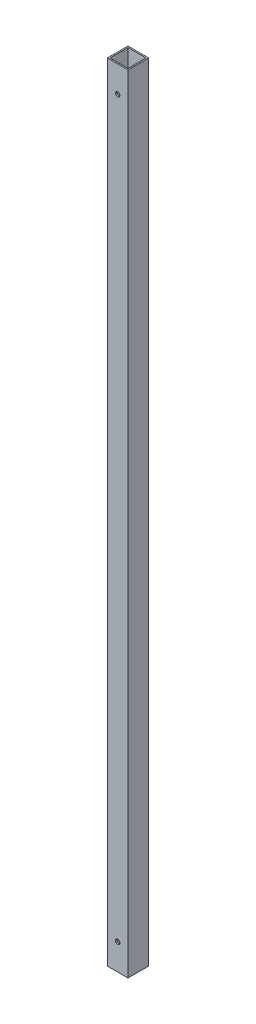
ISO-10303-21;
HEADER;
FILE_DESCRIPTION(('STEP AP214'),'2;1');
FILE_NAME('part.step','',(''),(''),'','','');
FILE_SCHEMA(('AUTOMOTIVE_DESIGN { 1 0 10303 214 1 1 1 1 }'));
ENDSEC;
DATA;
#1=APPLICATION_CONTEXT('core data for automotive mechanical design processes');
#2=APPLICATION_PROTOCOL_DEFINITION('international standard','automotive_design',2000,#1);
#3=PRODUCT_CONTEXT('',#1,'mechanical');
#4=PRODUCT('Part','Part','',(#3));
#5=PRODUCT_RELATED_PRODUCT_CATEGORY('part','',(#4));
#6=PRODUCT_DEFINITION_FORMATION('','',#4);
#7=PRODUCT_DEFINITION_CONTEXT('part definition',#1,'design');
#8=PRODUCT_DEFINITION('design','',#6,#7);
#9=PRODUCT_DEFINITION_SHAPE('','',#8);
#10=(LENGTH_UNIT() NAMED_UNIT(*) SI_UNIT(.MILLI.,.METRE.));
#11=(NAMED_UNIT(*) PLANE_ANGLE_UNIT() SI_UNIT($,.RADIAN.));
#12=(NAMED_UNIT(*) SI_UNIT($,.STERADIAN.) SOLID_ANGLE_UNIT());
#13=UNCERTAINTY_MEASURE_WITH_UNIT(LENGTH_MEASURE(1.E-05),#10,'distance_accuracy_value','');
#14=(GEOMETRIC_REPRESENTATION_CONTEXT(3) GLOBAL_UNCERTAINTY_ASSIGNED_CONTEXT((#13)) GLOBAL_UNIT_ASSIGNED_CONTEXT((#10,
#11,#12)) REPRESENTATION_CONTEXT('',''));
#15=CARTESIAN_POINT('',(0.,0.,0.));
#16=DIRECTION('',(0.,0.,1.));
#17=DIRECTION('',(1.,0.,0.));
#18=AXIS2_PLACEMENT_3D('',#15,#16,#17);
#19=CARTESIAN_POINT('',(0.,600.,0.));
#20=DIRECTION('',(0.,-1.,0.));
#21=DIRECTION('',(0.,0.,-1.));
#22=AXIS2_PLACEMENT_3D('',#19,#20,#21);
#23=PLANE('',#22);
#24=DIRECTION('',(0.,0.,-1.));
#25=VECTOR('',#24,1.);
#26=CARTESIAN_POINT('',(7.9,600.,7.9));
#27=LINE('',#26,#25);
#28=CARTESIAN_POINT('',(7.9,600.,7.9));
#29=VERTEX_POINT('',#28);
#30=CARTESIAN_POINT('',(7.9,600.,-7.9));
#31=VERTEX_POINT('',#30);
#32=EDGE_CURVE('E142',#29,#31,#27,.T.);
#33=ORIENTED_EDGE('',*,*,#32,.T.);
#34=DIRECTION('',(-1.,0.,0.));
#35=VECTOR('',#34,1.);
#36=CARTESIAN_POINT('',(-7.9,600.,-7.9));
#37=LINE('',#36,#35);
#38=CARTESIAN_POINT('',(-7.9,600.,-7.9));
#39=VERTEX_POINT('',#38);
#40=EDGE_CURVE('E145',#31,#39,#37,.T.);
#41=ORIENTED_EDGE('',*,*,#40,.T.);
#42=DIRECTION('',(0.,0.,1.));
#43=VECTOR('',#42,1.);
#44=CARTESIAN_POINT('',(-7.9,600.,7.9));
#45=LINE('',#44,#43);
#46=CARTESIAN_POINT('',(-7.9,600.,7.9));
#47=VERTEX_POINT('',#46);
#48=EDGE_CURVE('E148',#39,#47,#45,.T.);
#49=ORIENTED_EDGE('',*,*,#48,.T.);
#50=DIRECTION('',(1.,0.,0.));
#51=VECTOR('',#50,1.);
#52=CARTESIAN_POINT('',(-7.9,600.,7.9));
#53=LINE('',#52,#51);
#54=EDGE_CURVE('E150',#47,#29,#53,.T.);
#55=ORIENTED_EDGE('',*,*,#54,.T.);
#56=EDGE_LOOP('',(#33,#41,#49,#55));
#57=FACE_BOUND('',#56,.T.);
#58=DIRECTION('',(1.,0.,0.));
#59=VECTOR('',#58,1.);
#60=CARTESIAN_POINT('',(-6.9,600.,6.9));
#61=LINE('',#60,#59);
#62=CARTESIAN_POINT('',(-6.9,600.,6.9));
#63=VERTEX_POINT('',#62);
#64=CARTESIAN_POINT('',(6.9,600.,6.9));
#65=VERTEX_POINT('',#64);
#66=EDGE_CURVE('E104',#63,#65,#61,.T.);
#67=ORIENTED_EDGE('',*,*,#66,.F.);
#68=DIRECTION('',(0.,0.,1.));
#69=VECTOR('',#68,1.);
#70=CARTESIAN_POINT('',(-6.9,600.,6.9));
#71=LINE('',#70,#69);
#72=CARTESIAN_POINT('',(-6.9,600.,-6.9));
#73=VERTEX_POINT('',#72);
#74=EDGE_CURVE('E126',#73,#63,#71,.T.);
#75=ORIENTED_EDGE('',*,*,#74,.F.);
#76=DIRECTION('',(-1.,0.,0.));
#77=VECTOR('',#76,1.);
#78=CARTESIAN_POINT('',(-6.9,600.,-6.9));
#79=LINE('',#78,#77);
#80=CARTESIAN_POINT('',(6.9,600.,-6.9));
#81=VERTEX_POINT('',#80);
#82=EDGE_CURVE('E124',#81,#73,#79,.T.);
#83=ORIENTED_EDGE('',*,*,#82,.F.);
#84=DIRECTION('',(0.,0.,-1.));
#85=VECTOR('',#84,1.);
#86=CARTESIAN_POINT('',(6.9,600.,6.9));
#87=LINE('',#86,#85);
#88=EDGE_CURVE('E112',#65,#81,#87,.T.);
#89=ORIENTED_EDGE('',*,*,#88,.F.);
#90=EDGE_LOOP('',(#67,#75,#83,#89));
#91=FACE_BOUND('',#90,.T.);
#92=ADVANCED_FACE('F37',(#57,#91),#23,.F.);
#93=CARTESIAN_POINT('',(0.,0.,0.));
#94=DIRECTION('',(0.,-1.,0.));
#95=DIRECTION('',(0.,0.,-1.));
#96=AXIS2_PLACEMENT_3D('',#93,#94,#95);
#97=PLANE('',#96);
#98=DIRECTION('',(0.,0.,-1.));
#99=VECTOR('',#98,1.);
#100=CARTESIAN_POINT('',(7.9,0.,7.9));
#101=LINE('',#100,#99);
#102=CARTESIAN_POINT('',(7.9,0.,7.9));
#103=VERTEX_POINT('',#102);
#104=CARTESIAN_POINT('',(7.9,0.,-7.9));
#105=VERTEX_POINT('',#104);
#106=EDGE_CURVE('E120',#103,#105,#101,.T.);
#107=ORIENTED_EDGE('',*,*,#106,.F.);
#108=DIRECTION('',(1.,0.,0.));
#109=VECTOR('',#108,1.);
#110=CARTESIAN_POINT('',(-7.9,0.,7.9));
#111=LINE('',#110,#109);
#112=CARTESIAN_POINT('',(-7.9,0.,7.9));
#113=VERTEX_POINT('',#112);
#114=EDGE_CURVE('E146',#113,#103,#111,.T.);
#115=ORIENTED_EDGE('',*,*,#114,.F.);
#116=DIRECTION('',(0.,0.,1.));
#117=VECTOR('',#116,1.);
#118=CARTESIAN_POINT('',(-7.9,0.,7.9));
#119=LINE('',#118,#117);
#120=CARTESIAN_POINT('',(-7.9,0.,-7.9));
#121=VERTEX_POINT('',#120);
#122=EDGE_CURVE('E157',#121,#113,#119,.T.);
#123=ORIENTED_EDGE('',*,*,#122,.F.);
#124=DIRECTION('',(-1.,0.,0.));
#125=VECTOR('',#124,1.);
#126=CARTESIAN_POINT('',(-7.9,0.,-7.9));
#127=LINE('',#126,#125);
#128=EDGE_CURVE('E155',#105,#121,#127,.T.);
#129=ORIENTED_EDGE('',*,*,#128,.F.);
#130=EDGE_LOOP('',(#107,#115,#123,#129));
#131=FACE_BOUND('',#130,.T.);
#132=DIRECTION('',(0.,0.,1.));
#133=VECTOR('',#132,1.);
#134=CARTESIAN_POINT('',(-6.9,0.,6.9));
#135=LINE('',#134,#133);
#136=CARTESIAN_POINT('',(-6.9,0.,-6.9));
#137=VERTEX_POINT('',#136);
#138=CARTESIAN_POINT('',(-6.9,0.,6.9));
#139=VERTEX_POINT('',#138);
#140=EDGE_CURVE('E113',#137,#139,#135,.T.);
#141=ORIENTED_EDGE('',*,*,#140,.T.);
#142=DIRECTION('',(1.,0.,0.));
#143=VECTOR('',#142,1.);
#144=CARTESIAN_POINT('',(-6.9,0.,6.9));
#145=LINE('',#144,#143);
#146=CARTESIAN_POINT('',(6.9,0.,6.9));
#147=VERTEX_POINT('',#146);
#148=EDGE_CURVE('E62',#139,#147,#145,.T.);
#149=ORIENTED_EDGE('',*,*,#148,.T.);
#150=DIRECTION('',(0.,0.,-1.));
#151=VECTOR('',#150,1.);
#152=CARTESIAN_POINT('',(6.9,0.,6.9));
#153=LINE('',#152,#151);
#154=CARTESIAN_POINT('',(6.9,0.,-6.9));
#155=VERTEX_POINT('',#154);
#156=EDGE_CURVE('E119',#147,#155,#153,.T.);
#157=ORIENTED_EDGE('',*,*,#156,.T.);
#158=DIRECTION('',(-1.,0.,0.));
#159=VECTOR('',#158,1.);
#160=CARTESIAN_POINT('',(-6.9,0.,-6.9));
#161=LINE('',#160,#159);
#162=EDGE_CURVE('E134',#155,#137,#161,.T.);
#163=ORIENTED_EDGE('',*,*,#162,.T.);
#164=EDGE_LOOP('',(#141,#149,#157,#163));
#165=FACE_BOUND('',#164,.T.);
#166=ADVANCED_FACE('F204',(#131,#165),#97,.T.);
#167=CARTESIAN_POINT('',(7.9,600.,7.9));
#168=DIRECTION('',(-1.,0.,0.));
#169=DIRECTION('',(0.,0.,1.));
#170=AXIS2_PLACEMENT_3D('',#167,#168,#169);
#171=PLANE('',#170);
#172=ORIENTED_EDGE('',*,*,#106,.T.);
#173=DIRECTION('',(0.,-1.,0.));
#174=VECTOR('',#173,1.);
#175=CARTESIAN_POINT('',(7.9,600.,-7.9));
#176=LINE('',#175,#174);
#177=EDGE_CURVE('E11',#31,#105,#176,.T.);
#178=ORIENTED_EDGE('',*,*,#177,.F.);
#179=ORIENTED_EDGE('',*,*,#32,.F.);
#180=DIRECTION('',(0.,-1.,0.));
#181=VECTOR('',#180,1.);
#182=CARTESIAN_POINT('',(7.9,600.,7.9));
#183=LINE('',#182,#181);
#184=EDGE_CURVE('E152',#29,#103,#183,.T.);
#185=ORIENTED_EDGE('',*,*,#184,.T.);
#186=EDGE_LOOP('',(#172,#178,#179,#185));
#187=FACE_BOUND('',#186,.T.);
#188=ADVANCED_FACE('F39',(#187),#171,.F.);
#189=CARTESIAN_POINT('',(-7.9,600.,-7.9));
#190=DIRECTION('',(0.,0.,1.));
#191=DIRECTION('',(1.,0.,0.));
#192=AXIS2_PLACEMENT_3D('',#189,#190,#191);
#193=PLANE('',#192);
#194=CARTESIAN_POINT('',(0.,580.,-7.9));
#195=DIRECTION('',(0.,0.,1.));
#196=DIRECTION('',(1.,0.,0.));
#197=AXIS2_PLACEMENT_3D('',#194,#195,#196);
#198=CIRCLE('',#197,1.69999999999999);
#199=CARTESIAN_POINT('',(1.7,580.,-7.9));
#200=VERTEX_POINT('',#199);
#201=EDGE_CURVE('E169',#200,#200,#198,.T.);
#202=ORIENTED_EDGE('',*,*,#201,.T.);
#203=EDGE_LOOP('',(#202));
#204=FACE_BOUND('',#203,.T.);
#205=CARTESIAN_POINT('',(0.,20.,-7.9));
#206=DIRECTION('',(0.,0.,1.));
#207=DIRECTION('',(-1.,0.,0.));
#208=AXIS2_PLACEMENT_3D('',#205,#206,#207);
#209=CIRCLE('',#208,1.7);
#210=CARTESIAN_POINT('',(-1.7,20.,-7.9));
#211=VERTEX_POINT('',#210);
#212=EDGE_CURVE('E185',#211,#211,#209,.T.);
#213=ORIENTED_EDGE('',*,*,#212,.T.);
#214=EDGE_LOOP('',(#213));
#215=FACE_BOUND('',#214,.T.);
#216=ORIENTED_EDGE('',*,*,#128,.T.);
#217=DIRECTION('',(0.,-1.,0.));
#218=VECTOR('',#217,1.);
#219=CARTESIAN_POINT('',(-7.9,600.,-7.9));
#220=LINE('',#219,#218);
#221=EDGE_CURVE('E46',#39,#121,#220,.T.);
#222=ORIENTED_EDGE('',*,*,#221,.F.);
#223=ORIENTED_EDGE('',*,*,#40,.F.);
#224=ORIENTED_EDGE('',*,*,#177,.T.);
#225=EDGE_LOOP('',(#216,#222,#223,#224));
#226=FACE_BOUND('',#225,.T.);
#227=ADVANCED_FACE('F230',(#204,#215,#226),#193,.F.);
#228=CARTESIAN_POINT('',(-7.9,600.,7.9));
#229=DIRECTION('',(1.,0.,0.));
#230=DIRECTION('',(0.,0.,-1.));
#231=AXIS2_PLACEMENT_3D('',#228,#229,#230);
#232=PLANE('',#231);
#233=ORIENTED_EDGE('',*,*,#122,.T.);
#234=DIRECTION('',(0.,-1.,0.));
#235=VECTOR('',#234,1.);
#236=CARTESIAN_POINT('',(-7.9,600.,7.9));
#237=LINE('',#236,#235);
#238=EDGE_CURVE('E162',#47,#113,#237,.T.);
#239=ORIENTED_EDGE('',*,*,#238,.F.);
#240=ORIENTED_EDGE('',*,*,#48,.F.);
#241=ORIENTED_EDGE('',*,*,#221,.T.);
#242=EDGE_LOOP('',(#233,#239,#240,#241));
#243=FACE_BOUND('',#242,.T.);
#244=ADVANCED_FACE('F227',(#243),#232,.F.);
#245=CARTESIAN_POINT('',(-7.9,600.,7.9));
#246=DIRECTION('',(0.,0.,-1.));
#247=DIRECTION('',(-1.,0.,0.));
#248=AXIS2_PLACEMENT_3D('',#245,#246,#247);
#249=PLANE('',#248);
#250=CARTESIAN_POINT('',(0.,580.,7.9));
#251=DIRECTION('',(0.,0.,1.));
#252=DIRECTION('',(1.,0.,0.));
#253=AXIS2_PLACEMENT_3D('',#250,#251,#252);
#254=CIRCLE('',#253,1.69999999999999);
#255=CARTESIAN_POINT('',(1.7,580.,7.9));
#256=VERTEX_POINT('',#255);
#257=EDGE_CURVE('E175',#256,#256,#254,.T.);
#258=ORIENTED_EDGE('',*,*,#257,.F.);
#259=EDGE_LOOP('',(#258));
#260=FACE_BOUND('',#259,.T.);
#261=CARTESIAN_POINT('',(0.,20.,7.9));
#262=DIRECTION('',(0.,0.,1.));
#263=DIRECTION('',(-1.,0.,0.));
#264=AXIS2_PLACEMENT_3D('',#261,#262,#263);
#265=CIRCLE('',#264,1.7);
#266=CARTESIAN_POINT('',(-1.7,20.,7.9));
#267=VERTEX_POINT('',#266);
#268=EDGE_CURVE('E180',#267,#267,#265,.T.);
#269=ORIENTED_EDGE('',*,*,#268,.F.);
#270=EDGE_LOOP('',(#269));
#271=FACE_BOUND('',#270,.T.);
#272=ORIENTED_EDGE('',*,*,#114,.T.);
#273=ORIENTED_EDGE('',*,*,#184,.F.);
#274=ORIENTED_EDGE('',*,*,#54,.F.);
#275=ORIENTED_EDGE('',*,*,#238,.T.);
#276=EDGE_LOOP('',(#272,#273,#274,#275));
#277=FACE_BOUND('',#276,.T.);
#278=ADVANCED_FACE('F224',(#260,#271,#277),#249,.F.);
#279=CARTESIAN_POINT('',(-6.9,600.,6.9));
#280=DIRECTION('',(0.,0.,-1.));
#281=DIRECTION('',(-1.,0.,0.));
#282=AXIS2_PLACEMENT_3D('',#279,#280,#281);
#283=PLANE('',#282);
#284=CARTESIAN_POINT('',(0.,580.,6.9));
#285=DIRECTION('',(0.,0.,-1.));
#286=DIRECTION('',(-1.,0.,0.));
#287=AXIS2_PLACEMENT_3D('',#284,#285,#286);
#288=CIRCLE('',#287,1.69999999999999);
#289=CARTESIAN_POINT('',(-1.69999999999999,580.,6.9));
#290=VERTEX_POINT('',#289);
#291=EDGE_CURVE('E132',#290,#290,#288,.T.);
#292=ORIENTED_EDGE('',*,*,#291,.F.);
#293=EDGE_LOOP('',(#292));
#294=FACE_BOUND('',#293,.T.);
#295=CARTESIAN_POINT('',(0.,20.,6.9));
#296=DIRECTION('',(0.,0.,-1.));
#297=DIRECTION('',(-1.,0.,0.));
#298=AXIS2_PLACEMENT_3D('',#295,#296,#297);
#299=CIRCLE('',#298,1.7);
#300=CARTESIAN_POINT('',(-1.7,20.,6.9));
#301=VERTEX_POINT('',#300);
#302=EDGE_CURVE('E168',#301,#301,#299,.T.);
#303=ORIENTED_EDGE('',*,*,#302,.F.);
#304=EDGE_LOOP('',(#303));
#305=FACE_BOUND('',#304,.T.);
#306=ORIENTED_EDGE('',*,*,#148,.F.);
#307=DIRECTION('',(0.,-1.,0.));
#308=VECTOR('',#307,1.);
#309=CARTESIAN_POINT('',(-6.9,600.,6.9));
#310=LINE('',#309,#308);
#311=EDGE_CURVE('E108',#63,#139,#310,.T.);
#312=ORIENTED_EDGE('',*,*,#311,.F.);
#313=ORIENTED_EDGE('',*,*,#66,.T.);
#314=DIRECTION('',(0.,-1.,0.));
#315=VECTOR('',#314,1.);
#316=CARTESIAN_POINT('',(6.9,600.,6.9));
#317=LINE('',#316,#315);
#318=EDGE_CURVE('E107',#65,#147,#317,.T.);
#319=ORIENTED_EDGE('',*,*,#318,.T.);
#320=EDGE_LOOP('',(#306,#312,#313,#319));
#321=FACE_BOUND('',#320,.T.);
#322=ADVANCED_FACE('F106',(#294,#305,#321),#283,.T.);
#323=CARTESIAN_POINT('',(6.9,600.,6.9));
#324=DIRECTION('',(-1.,0.,0.));
#325=DIRECTION('',(0.,0.,1.));
#326=AXIS2_PLACEMENT_3D('',#323,#324,#325);
#327=PLANE('',#326);
#328=ORIENTED_EDGE('',*,*,#156,.F.);
#329=ORIENTED_EDGE('',*,*,#318,.F.);
#330=ORIENTED_EDGE('',*,*,#88,.T.);
#331=DIRECTION('',(0.,-1.,0.));
#332=VECTOR('',#331,1.);
#333=CARTESIAN_POINT('',(6.9,600.,-6.9));
#334=LINE('',#333,#332);
#335=EDGE_CURVE('E121',#81,#155,#334,.T.);
#336=ORIENTED_EDGE('',*,*,#335,.T.);
#337=EDGE_LOOP('',(#328,#329,#330,#336));
#338=FACE_BOUND('',#337,.T.);
#339=ADVANCED_FACE('F116',(#338),#327,.T.);
#340=CARTESIAN_POINT('',(-6.9,600.,-6.9));
#341=DIRECTION('',(0.,0.,1.));
#342=DIRECTION('',(1.,0.,0.));
#343=AXIS2_PLACEMENT_3D('',#340,#341,#342);
#344=PLANE('',#343);
#345=CARTESIAN_POINT('',(0.,580.,-6.9));
#346=DIRECTION('',(0.,0.,1.));
#347=DIRECTION('',(1.,0.,0.));
#348=AXIS2_PLACEMENT_3D('',#345,#346,#347);
#349=CIRCLE('',#348,1.69999999999999);
#350=CARTESIAN_POINT('',(1.7,580.,-6.9));
#351=VERTEX_POINT('',#350);
#352=EDGE_CURVE('E41',#351,#351,#349,.T.);
#353=ORIENTED_EDGE('',*,*,#352,.F.);
#354=EDGE_LOOP('',(#353));
#355=FACE_BOUND('',#354,.T.);
#356=CARTESIAN_POINT('',(0.,20.,-6.9));
#357=DIRECTION('',(0.,0.,1.));
#358=DIRECTION('',(1.,0.,0.));
#359=AXIS2_PLACEMENT_3D('',#356,#357,#358);
#360=CIRCLE('',#359,1.7);
#361=CARTESIAN_POINT('',(1.7,20.,-6.9));
#362=VERTEX_POINT('',#361);
#363=EDGE_CURVE('E166',#362,#362,#360,.T.);
#364=ORIENTED_EDGE('',*,*,#363,.F.);
#365=EDGE_LOOP('',(#364));
#366=FACE_BOUND('',#365,.T.);
#367=ORIENTED_EDGE('',*,*,#162,.F.);
#368=ORIENTED_EDGE('',*,*,#335,.F.);
#369=ORIENTED_EDGE('',*,*,#82,.T.);
#370=DIRECTION('',(0.,-1.,0.));
#371=VECTOR('',#370,1.);
#372=CARTESIAN_POINT('',(-6.9,600.,-6.9));
#373=LINE('',#372,#371);
#374=EDGE_CURVE('E54',#73,#137,#373,.T.);
#375=ORIENTED_EDGE('',*,*,#374,.T.);
#376=EDGE_LOOP('',(#367,#368,#369,#375));
#377=FACE_BOUND('',#376,.T.);
#378=ADVANCED_FACE('F196',(#355,#366,#377),#344,.T.);
#379=CARTESIAN_POINT('',(-6.9,600.,6.9));
#380=DIRECTION('',(1.,0.,0.));
#381=DIRECTION('',(0.,0.,-1.));
#382=AXIS2_PLACEMENT_3D('',#379,#380,#381);
#383=PLANE('',#382);
#384=ORIENTED_EDGE('',*,*,#140,.F.);
#385=ORIENTED_EDGE('',*,*,#374,.F.);
#386=ORIENTED_EDGE('',*,*,#74,.T.);
#387=ORIENTED_EDGE('',*,*,#311,.T.);
#388=EDGE_LOOP('',(#384,#385,#386,#387));
#389=FACE_BOUND('',#388,.T.);
#390=ADVANCED_FACE('F199',(#389),#383,.T.);
#391=CARTESIAN_POINT('',(0.,20.,-7.9));
#392=DIRECTION('',(0.,0.,1.));
#393=DIRECTION('',(1.,0.,0.));
#394=AXIS2_PLACEMENT_3D('',#391,#392,#393);
#395=CYLINDRICAL_SURFACE('',#394,1.7);
#396=ORIENTED_EDGE('',*,*,#363,.T.);
#397=EDGE_LOOP('',(#396));
#398=FACE_BOUND('',#397,.T.);
#399=ORIENTED_EDGE('',*,*,#212,.F.);
#400=EDGE_LOOP('',(#399));
#401=FACE_BOUND('',#400,.T.);
#402=ADVANCED_FACE('F206',(#398,#401),#395,.F.);
#403=CARTESIAN_POINT('',(0.,580.,-7.9));
#404=DIRECTION('',(0.,0.,1.));
#405=DIRECTION('',(1.,0.,0.));
#406=AXIS2_PLACEMENT_3D('',#403,#404,#405);
#407=CYLINDRICAL_SURFACE('',#406,1.69999999999999);
#408=ORIENTED_EDGE('',*,*,#352,.T.);
#409=EDGE_LOOP('',(#408));
#410=FACE_BOUND('',#409,.T.);
#411=ORIENTED_EDGE('',*,*,#201,.F.);
#412=EDGE_LOOP('',(#411));
#413=FACE_BOUND('',#412,.T.);
#414=ADVANCED_FACE('F193',(#410,#413),#407,.F.);
#415=ORIENTED_EDGE('',*,*,#302,.T.);
#416=EDGE_LOOP('',(#415));
#417=FACE_BOUND('',#416,.T.);
#418=ORIENTED_EDGE('',*,*,#268,.T.);
#419=EDGE_LOOP('',(#418));
#420=FACE_BOUND('',#419,.T.);
#421=ADVANCED_FACE('F212',(#417,#420),#395,.F.);
#422=ORIENTED_EDGE('',*,*,#291,.T.);
#423=EDGE_LOOP('',(#422));
#424=FACE_BOUND('',#423,.T.);
#425=ORIENTED_EDGE('',*,*,#257,.T.);
#426=EDGE_LOOP('',(#425));
#427=FACE_BOUND('',#426,.T.);
#428=ADVANCED_FACE('F329',(#424,#427),#407,.F.);
#429=CLOSED_SHELL('',(#92,#166,#188,#227,#244,#278,#322,#339,#378,#390,#402,#414,#421,#428));
#430=MANIFOLD_SOLID_BREP('B2',#429);
#431=ADVANCED_BREP_SHAPE_REPRESENTATION('',(#18,#430),#14);
#432=SHAPE_DEFINITION_REPRESENTATION(#9,#431);
ENDSEC;
END-ISO-10303-21;
